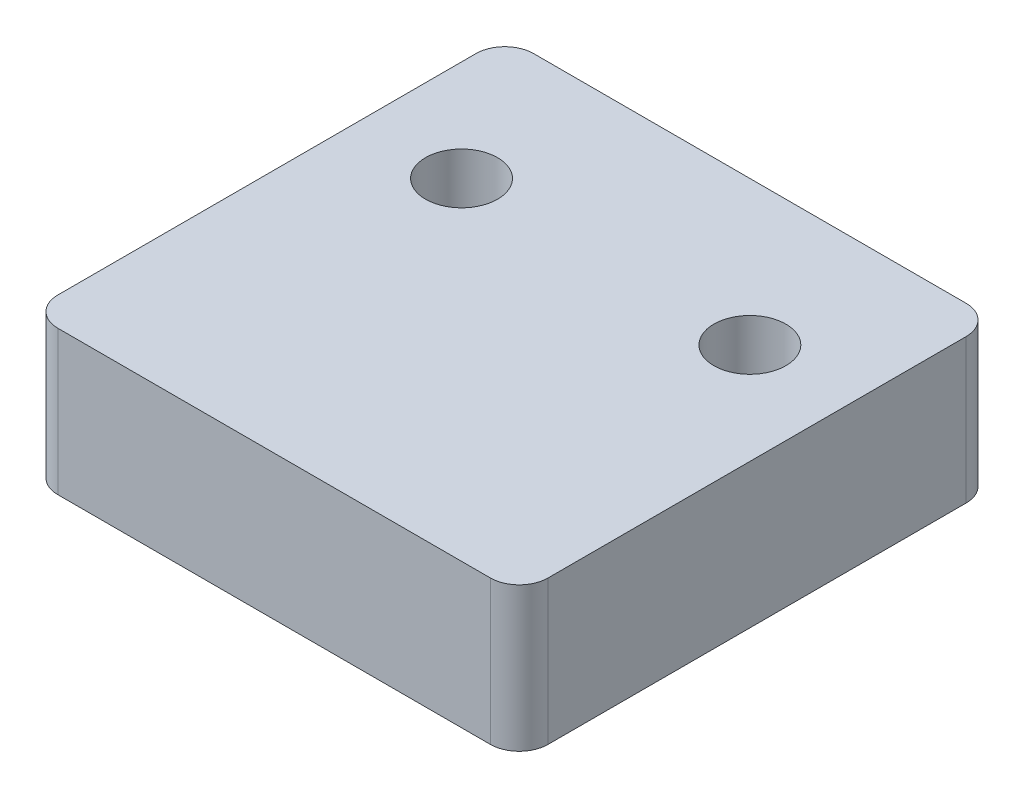
ISO-10303-21;
HEADER;
FILE_DESCRIPTION(('STEP AP214'),'2;1');
FILE_NAME('part.step','',(''),(''),'','','');
FILE_SCHEMA(('AUTOMOTIVE_DESIGN { 1 0 10303 214 1 1 1 1 }'));
ENDSEC;
DATA;
#1=APPLICATION_CONTEXT('core data for automotive mechanical design processes');
#2=APPLICATION_PROTOCOL_DEFINITION('international standard','automotive_design',2000,#1);
#3=PRODUCT_CONTEXT('',#1,'mechanical');
#4=PRODUCT('Part','Part','',(#3));
#5=PRODUCT_RELATED_PRODUCT_CATEGORY('part','',(#4));
#6=PRODUCT_DEFINITION_FORMATION('','',#4);
#7=PRODUCT_DEFINITION_CONTEXT('part definition',#1,'design');
#8=PRODUCT_DEFINITION('design','',#6,#7);
#9=PRODUCT_DEFINITION_SHAPE('','',#8);
#10=(LENGTH_UNIT() NAMED_UNIT(*) SI_UNIT(.MILLI.,.METRE.));
#11=(NAMED_UNIT(*) PLANE_ANGLE_UNIT() SI_UNIT($,.RADIAN.));
#12=(NAMED_UNIT(*) SI_UNIT($,.STERADIAN.) SOLID_ANGLE_UNIT());
#13=UNCERTAINTY_MEASURE_WITH_UNIT(LENGTH_MEASURE(1.E-05),#10,'distance_accuracy_value','');
#14=(GEOMETRIC_REPRESENTATION_CONTEXT(3) GLOBAL_UNCERTAINTY_ASSIGNED_CONTEXT((#13)) GLOBAL_UNIT_ASSIGNED_CONTEXT((#10,
#11,#12)) REPRESENTATION_CONTEXT('',''));
#15=CARTESIAN_POINT('',(0.,0.,0.));
#16=DIRECTION('',(0.,0.,1.));
#17=DIRECTION('',(1.,0.,0.));
#18=AXIS2_PLACEMENT_3D('',#15,#16,#17);
#19=CARTESIAN_POINT('',(2.,10.,-2.));
#20=DIRECTION('',(0.,1.,0.));
#21=DIRECTION('',(0.,0.,1.));
#22=AXIS2_PLACEMENT_3D('',#19,#20,#21);
#23=CYLINDRICAL_SURFACE('',#22,2.);
#24=DIRECTION('',(0.,1.,0.));
#25=VECTOR('',#24,1.);
#26=CARTESIAN_POINT('',(0.,10.,-2.));
#27=LINE('',#26,#25);
#28=CARTESIAN_POINT('',(0.,0.,-2.));
#29=VERTEX_POINT('',#28);
#30=CARTESIAN_POINT('',(0.,10.,-2.));
#31=VERTEX_POINT('',#30);
#32=EDGE_CURVE('E147',#29,#31,#27,.T.);
#33=ORIENTED_EDGE('',*,*,#32,.F.);
#34=CARTESIAN_POINT('',(2.,0.,-2.));
#35=DIRECTION('',(0.,-1.,0.));
#36=DIRECTION('',(0.,0.,-1.));
#37=AXIS2_PLACEMENT_3D('',#34,#35,#36);
#38=CIRCLE('',#37,2.);
#39=CARTESIAN_POINT('',(2.,0.,0.));
#40=VERTEX_POINT('',#39);
#41=EDGE_CURVE('E39',#40,#29,#38,.T.);
#42=ORIENTED_EDGE('',*,*,#41,.F.);
#43=DIRECTION('',(0.,1.,0.));
#44=VECTOR('',#43,1.);
#45=CARTESIAN_POINT('',(2.,10.,0.));
#46=LINE('',#45,#44);
#47=CARTESIAN_POINT('',(2.,10.,0.));
#48=VERTEX_POINT('',#47);
#49=EDGE_CURVE('E99',#48,#40,#46,.F.);
#50=ORIENTED_EDGE('',*,*,#49,.F.);
#51=CARTESIAN_POINT('',(2.,10.,-2.));
#52=DIRECTION('',(0.,-1.,0.));
#53=DIRECTION('',(0.,0.,-1.));
#54=AXIS2_PLACEMENT_3D('',#51,#52,#53);
#55=CIRCLE('',#54,2.);
#56=EDGE_CURVE('E11',#31,#48,#55,.F.);
#57=ORIENTED_EDGE('',*,*,#56,.F.);
#58=EDGE_LOOP('',(#33,#42,#50,#57));
#59=FACE_BOUND('',#58,.T.);
#60=ADVANCED_FACE('F32',(#59),#23,.T.);
#61=CARTESIAN_POINT('',(2.,10.,-31.));
#62=DIRECTION('',(0.,1.,0.));
#63=DIRECTION('',(0.,0.,1.));
#64=AXIS2_PLACEMENT_3D('',#61,#62,#63);
#65=CYLINDRICAL_SURFACE('',#64,2.);
#66=DIRECTION('',(0.,1.,0.));
#67=VECTOR('',#66,1.);
#68=CARTESIAN_POINT('',(2.,10.,-33.));
#69=LINE('',#68,#67);
#70=CARTESIAN_POINT('',(2.,0.,-33.));
#71=VERTEX_POINT('',#70);
#72=CARTESIAN_POINT('',(2.,10.,-33.));
#73=VERTEX_POINT('',#72);
#74=EDGE_CURVE('E137',#71,#73,#69,.T.);
#75=ORIENTED_EDGE('',*,*,#74,.F.);
#76=CARTESIAN_POINT('',(2.,0.,-31.));
#77=DIRECTION('',(0.,-1.,0.));
#78=DIRECTION('',(0.,0.,-1.));
#79=AXIS2_PLACEMENT_3D('',#76,#77,#78);
#80=CIRCLE('',#79,2.);
#81=CARTESIAN_POINT('',(0.,0.,-31.));
#82=VERTEX_POINT('',#81);
#83=EDGE_CURVE('E143',#82,#71,#80,.T.);
#84=ORIENTED_EDGE('',*,*,#83,.F.);
#85=DIRECTION('',(0.,1.,0.));
#86=VECTOR('',#85,1.);
#87=CARTESIAN_POINT('',(0.,10.,-31.));
#88=LINE('',#87,#86);
#89=CARTESIAN_POINT('',(0.,10.,-31.));
#90=VERTEX_POINT('',#89);
#91=EDGE_CURVE('E140',#90,#82,#88,.F.);
#92=ORIENTED_EDGE('',*,*,#91,.F.);
#93=CARTESIAN_POINT('',(2.,10.,-31.));
#94=DIRECTION('',(0.,-1.,0.));
#95=DIRECTION('',(0.,0.,-1.));
#96=AXIS2_PLACEMENT_3D('',#93,#94,#95);
#97=CIRCLE('',#96,2.);
#98=EDGE_CURVE('E145',#73,#90,#97,.F.);
#99=ORIENTED_EDGE('',*,*,#98,.F.);
#100=EDGE_LOOP('',(#75,#84,#92,#99));
#101=FACE_BOUND('',#100,.T.);
#102=ADVANCED_FACE('F183',(#101),#65,.T.);
#103=CARTESIAN_POINT('',(32.,10.,-31.));
#104=DIRECTION('',(0.,1.,0.));
#105=DIRECTION('',(0.,0.,1.));
#106=AXIS2_PLACEMENT_3D('',#103,#104,#105);
#107=CYLINDRICAL_SURFACE('',#106,2.);
#108=DIRECTION('',(0.,1.,0.));
#109=VECTOR('',#108,1.);
#110=CARTESIAN_POINT('',(34.,10.,-31.));
#111=LINE('',#110,#109);
#112=CARTESIAN_POINT('',(34.,0.,-31.));
#113=VERTEX_POINT('',#112);
#114=CARTESIAN_POINT('',(34.,10.,-31.));
#115=VERTEX_POINT('',#114);
#116=EDGE_CURVE('E127',#113,#115,#111,.T.);
#117=ORIENTED_EDGE('',*,*,#116,.F.);
#118=CARTESIAN_POINT('',(32.,0.,-31.));
#119=DIRECTION('',(0.,-1.,0.));
#120=DIRECTION('',(0.,0.,-1.));
#121=AXIS2_PLACEMENT_3D('',#118,#119,#120);
#122=CIRCLE('',#121,2.);
#123=CARTESIAN_POINT('',(32.,0.,-33.));
#124=VERTEX_POINT('',#123);
#125=EDGE_CURVE('E133',#124,#113,#122,.T.);
#126=ORIENTED_EDGE('',*,*,#125,.F.);
#127=DIRECTION('',(0.,1.,0.));
#128=VECTOR('',#127,1.);
#129=CARTESIAN_POINT('',(32.,10.,-33.));
#130=LINE('',#129,#128);
#131=CARTESIAN_POINT('',(32.,10.,-33.));
#132=VERTEX_POINT('',#131);
#133=EDGE_CURVE('E130',#132,#124,#130,.F.);
#134=ORIENTED_EDGE('',*,*,#133,.F.);
#135=CARTESIAN_POINT('',(32.,10.,-31.));
#136=DIRECTION('',(0.,-1.,0.));
#137=DIRECTION('',(0.,0.,-1.));
#138=AXIS2_PLACEMENT_3D('',#135,#136,#137);
#139=CIRCLE('',#138,2.);
#140=EDGE_CURVE('E135',#115,#132,#139,.F.);
#141=ORIENTED_EDGE('',*,*,#140,.F.);
#142=EDGE_LOOP('',(#117,#126,#134,#141));
#143=FACE_BOUND('',#142,.T.);
#144=ADVANCED_FACE('F178',(#143),#107,.T.);
#145=CARTESIAN_POINT('',(32.,10.,-2.));
#146=DIRECTION('',(0.,1.,0.));
#147=DIRECTION('',(0.,0.,1.));
#148=AXIS2_PLACEMENT_3D('',#145,#146,#147);
#149=CYLINDRICAL_SURFACE('',#148,2.);
#150=DIRECTION('',(0.,1.,0.));
#151=VECTOR('',#150,1.);
#152=CARTESIAN_POINT('',(32.,10.,0.));
#153=LINE('',#152,#151);
#154=CARTESIAN_POINT('',(32.,0.,0.));
#155=VERTEX_POINT('',#154);
#156=CARTESIAN_POINT('',(32.,10.,0.));
#157=VERTEX_POINT('',#156);
#158=EDGE_CURVE('E98',#155,#157,#153,.T.);
#159=ORIENTED_EDGE('',*,*,#158,.F.);
#160=CARTESIAN_POINT('',(32.,0.,-2.));
#161=DIRECTION('',(0.,-1.,0.));
#162=DIRECTION('',(0.,0.,-1.));
#163=AXIS2_PLACEMENT_3D('',#160,#161,#162);
#164=CIRCLE('',#163,2.);
#165=CARTESIAN_POINT('',(34.,0.,-2.));
#166=VERTEX_POINT('',#165);
#167=EDGE_CURVE('E105',#166,#155,#164,.T.);
#168=ORIENTED_EDGE('',*,*,#167,.F.);
#169=DIRECTION('',(0.,1.,0.));
#170=VECTOR('',#169,1.);
#171=CARTESIAN_POINT('',(34.,10.,-2.));
#172=LINE('',#171,#170);
#173=CARTESIAN_POINT('',(34.,10.,-2.));
#174=VERTEX_POINT('',#173);
#175=EDGE_CURVE('E112',#174,#166,#172,.F.);
#176=ORIENTED_EDGE('',*,*,#175,.F.);
#177=CARTESIAN_POINT('',(32.,10.,-2.));
#178=DIRECTION('',(0.,-1.,0.));
#179=DIRECTION('',(0.,0.,-1.));
#180=AXIS2_PLACEMENT_3D('',#177,#178,#179);
#181=CIRCLE('',#180,2.);
#182=EDGE_CURVE('E111',#157,#174,#181,.F.);
#183=ORIENTED_EDGE('',*,*,#182,.F.);
#184=EDGE_LOOP('',(#159,#168,#176,#183));
#185=FACE_BOUND('',#184,.T.);
#186=ADVANCED_FACE('F115',(#185),#149,.T.);
#187=CARTESIAN_POINT('',(0.,10.,0.));
#188=DIRECTION('',(1.,0.,0.));
#189=DIRECTION('',(0.,0.,-1.));
#190=AXIS2_PLACEMENT_3D('',#187,#188,#189);
#191=PLANE('',#190);
#192=DIRECTION('',(0.,0.,1.));
#193=VECTOR('',#192,1.);
#194=CARTESIAN_POINT('',(0.,0.,0.));
#195=LINE('',#194,#193);
#196=EDGE_CURVE('E102',#82,#29,#195,.T.);
#197=ORIENTED_EDGE('',*,*,#196,.T.);
#198=ORIENTED_EDGE('',*,*,#32,.T.);
#199=DIRECTION('',(0.,0.,1.));
#200=VECTOR('',#199,1.);
#201=CARTESIAN_POINT('',(0.,10.,0.));
#202=LINE('',#201,#200);
#203=EDGE_CURVE('E164',#90,#31,#202,.T.);
#204=ORIENTED_EDGE('',*,*,#203,.F.);
#205=ORIENTED_EDGE('',*,*,#91,.T.);
#206=EDGE_LOOP('',(#197,#198,#204,#205));
#207=FACE_BOUND('',#206,.T.);
#208=ADVANCED_FACE('F154',(#207),#191,.F.);
#209=CARTESIAN_POINT('',(0.,10.,0.));
#210=DIRECTION('',(0.,0.,-1.));
#211=DIRECTION('',(-1.,0.,0.));
#212=AXIS2_PLACEMENT_3D('',#209,#210,#211);
#213=PLANE('',#212);
#214=DIRECTION('',(1.,0.,0.));
#215=VECTOR('',#214,1.);
#216=CARTESIAN_POINT('',(0.,10.,0.));
#217=LINE('',#216,#215);
#218=EDGE_CURVE('E167',#48,#157,#217,.T.);
#219=ORIENTED_EDGE('',*,*,#218,.F.);
#220=ORIENTED_EDGE('',*,*,#49,.T.);
#221=DIRECTION('',(1.,0.,0.));
#222=VECTOR('',#221,1.);
#223=CARTESIAN_POINT('',(0.,0.,0.));
#224=LINE('',#223,#222);
#225=EDGE_CURVE('E93',#40,#155,#224,.T.);
#226=ORIENTED_EDGE('',*,*,#225,.T.);
#227=ORIENTED_EDGE('',*,*,#158,.T.);
#228=EDGE_LOOP('',(#219,#220,#226,#227));
#229=FACE_BOUND('',#228,.T.);
#230=ADVANCED_FACE('F96',(#229),#213,.F.);
#231=CARTESIAN_POINT('',(34.,10.,0.));
#232=DIRECTION('',(-1.,0.,0.));
#233=DIRECTION('',(0.,0.,1.));
#234=AXIS2_PLACEMENT_3D('',#231,#232,#233);
#235=PLANE('',#234);
#236=DIRECTION('',(0.,0.,-1.));
#237=VECTOR('',#236,1.);
#238=CARTESIAN_POINT('',(34.,0.,0.));
#239=LINE('',#238,#237);
#240=EDGE_CURVE('E101',#166,#113,#239,.T.);
#241=ORIENTED_EDGE('',*,*,#240,.T.);
#242=ORIENTED_EDGE('',*,*,#116,.T.);
#243=DIRECTION('',(0.,0.,-1.));
#244=VECTOR('',#243,1.);
#245=CARTESIAN_POINT('',(34.,10.,0.));
#246=LINE('',#245,#244);
#247=EDGE_CURVE('E120',#174,#115,#246,.T.);
#248=ORIENTED_EDGE('',*,*,#247,.F.);
#249=ORIENTED_EDGE('',*,*,#175,.T.);
#250=EDGE_LOOP('',(#241,#242,#248,#249));
#251=FACE_BOUND('',#250,.T.);
#252=ADVANCED_FACE('F175',(#251),#235,.F.);
#253=CARTESIAN_POINT('',(0.,10.,-33.));
#254=DIRECTION('',(0.,0.,1.));
#255=DIRECTION('',(1.,0.,0.));
#256=AXIS2_PLACEMENT_3D('',#253,#254,#255);
#257=PLANE('',#256);
#258=DIRECTION('',(-1.,0.,0.));
#259=VECTOR('',#258,1.);
#260=CARTESIAN_POINT('',(0.,0.,-33.));
#261=LINE('',#260,#259);
#262=EDGE_CURVE('E123',#124,#71,#261,.T.);
#263=ORIENTED_EDGE('',*,*,#262,.T.);
#264=ORIENTED_EDGE('',*,*,#74,.T.);
#265=DIRECTION('',(-1.,0.,0.));
#266=VECTOR('',#265,1.);
#267=CARTESIAN_POINT('',(0.,10.,-33.));
#268=LINE('',#267,#266);
#269=EDGE_CURVE('E116',#132,#73,#268,.T.);
#270=ORIENTED_EDGE('',*,*,#269,.F.);
#271=ORIENTED_EDGE('',*,*,#133,.T.);
#272=EDGE_LOOP('',(#263,#264,#270,#271));
#273=FACE_BOUND('',#272,.T.);
#274=ADVANCED_FACE('F180',(#273),#257,.F.);
#275=CARTESIAN_POINT('',(0.,10.,0.));
#276=DIRECTION('',(0.,-1.,0.));
#277=DIRECTION('',(0.,0.,-1.));
#278=AXIS2_PLACEMENT_3D('',#275,#276,#277);
#279=PLANE('',#278);
#280=CARTESIAN_POINT('',(27.,10.,-23.));
#281=DIRECTION('',(0.,1.,0.));
#282=DIRECTION('',(0.,0.,1.));
#283=AXIS2_PLACEMENT_3D('',#280,#281,#282);
#284=CIRCLE('',#283,2.5);
#285=CARTESIAN_POINT('',(27.,10.,-20.5));
#286=VERTEX_POINT('',#285);
#287=EDGE_CURVE('E222',#286,#286,#284,.T.);
#288=ORIENTED_EDGE('',*,*,#287,.F.);
#289=EDGE_LOOP('',(#288));
#290=FACE_BOUND('',#289,.T.);
#291=CARTESIAN_POINT('',(7.,10.,-23.));
#292=DIRECTION('',(0.,1.,0.));
#293=DIRECTION('',(0.,0.,1.));
#294=AXIS2_PLACEMENT_3D('',#291,#292,#293);
#295=CIRCLE('',#294,2.5);
#296=CARTESIAN_POINT('',(7.,10.,-20.5));
#297=VERTEX_POINT('',#296);
#298=EDGE_CURVE('E159',#297,#297,#295,.T.);
#299=ORIENTED_EDGE('',*,*,#298,.F.);
#300=EDGE_LOOP('',(#299));
#301=FACE_BOUND('',#300,.T.);
#302=ORIENTED_EDGE('',*,*,#203,.T.);
#303=ORIENTED_EDGE('',*,*,#56,.T.);
#304=ORIENTED_EDGE('',*,*,#218,.T.);
#305=ORIENTED_EDGE('',*,*,#182,.T.);
#306=ORIENTED_EDGE('',*,*,#247,.T.);
#307=ORIENTED_EDGE('',*,*,#140,.T.);
#308=ORIENTED_EDGE('',*,*,#269,.T.);
#309=ORIENTED_EDGE('',*,*,#98,.T.);
#310=EDGE_LOOP('',(#302,#303,#304,#305,#306,#307,#308,#309));
#311=FACE_BOUND('',#310,.T.);
#312=ADVANCED_FACE('F173',(#290,#301,#311),#279,.F.);
#313=CARTESIAN_POINT('',(0.,0.,0.));
#314=DIRECTION('',(0.,-1.,0.));
#315=DIRECTION('',(0.,0.,-1.));
#316=AXIS2_PLACEMENT_3D('',#313,#314,#315);
#317=PLANE('',#316);
#318=CARTESIAN_POINT('',(27.,0.,-23.));
#319=DIRECTION('',(0.,1.,0.));
#320=DIRECTION('',(0.,0.,1.));
#321=AXIS2_PLACEMENT_3D('',#318,#319,#320);
#322=CIRCLE('',#321,2.5);
#323=CARTESIAN_POINT('',(27.,0.,-20.5));
#324=VERTEX_POINT('',#323);
#325=EDGE_CURVE('E219',#324,#324,#322,.T.);
#326=ORIENTED_EDGE('',*,*,#325,.T.);
#327=EDGE_LOOP('',(#326));
#328=FACE_BOUND('',#327,.T.);
#329=CARTESIAN_POINT('',(7.,0.,-23.));
#330=DIRECTION('',(0.,1.,0.));
#331=DIRECTION('',(0.,0.,1.));
#332=AXIS2_PLACEMENT_3D('',#329,#330,#331);
#333=CIRCLE('',#332,2.5);
#334=CARTESIAN_POINT('',(7.,0.,-20.5));
#335=VERTEX_POINT('',#334);
#336=EDGE_CURVE('E156',#335,#335,#333,.T.);
#337=ORIENTED_EDGE('',*,*,#336,.T.);
#338=EDGE_LOOP('',(#337));
#339=FACE_BOUND('',#338,.T.);
#340=ORIENTED_EDGE('',*,*,#225,.F.);
#341=ORIENTED_EDGE('',*,*,#41,.T.);
#342=ORIENTED_EDGE('',*,*,#196,.F.);
#343=ORIENTED_EDGE('',*,*,#83,.T.);
#344=ORIENTED_EDGE('',*,*,#262,.F.);
#345=ORIENTED_EDGE('',*,*,#125,.T.);
#346=ORIENTED_EDGE('',*,*,#240,.F.);
#347=ORIENTED_EDGE('',*,*,#167,.T.);
#348=EDGE_LOOP('',(#340,#341,#342,#343,#344,#345,#346,#347));
#349=FACE_BOUND('',#348,.T.);
#350=ADVANCED_FACE('F106',(#328,#339,#349),#317,.T.);
#351=CARTESIAN_POINT('',(7.,0.,-23.));
#352=DIRECTION('',(0.,1.,0.));
#353=DIRECTION('',(0.,0.,1.));
#354=AXIS2_PLACEMENT_3D('',#351,#352,#353);
#355=CYLINDRICAL_SURFACE('',#354,2.5);
#356=ORIENTED_EDGE('',*,*,#336,.F.);
#357=EDGE_LOOP('',(#356));
#358=FACE_BOUND('',#357,.T.);
#359=ORIENTED_EDGE('',*,*,#298,.T.);
#360=EDGE_LOOP('',(#359));
#361=FACE_BOUND('',#360,.T.);
#362=ADVANCED_FACE('F203',(#358,#361),#355,.F.);
#363=CARTESIAN_POINT('',(27.,0.,-23.));
#364=DIRECTION('',(0.,1.,0.));
#365=DIRECTION('',(0.,0.,1.));
#366=AXIS2_PLACEMENT_3D('',#363,#364,#365);
#367=CYLINDRICAL_SURFACE('',#366,2.5);
#368=ORIENTED_EDGE('',*,*,#325,.F.);
#369=EDGE_LOOP('',(#368));
#370=FACE_BOUND('',#369,.T.);
#371=ORIENTED_EDGE('',*,*,#287,.T.);
#372=EDGE_LOOP('',(#371));
#373=FACE_BOUND('',#372,.T.);
#374=ADVANCED_FACE('F210',(#370,#373),#367,.F.);
#375=CLOSED_SHELL('',(#60,#102,#144,#186,#208,#230,#252,#274,#312,#350,#362,#374));
#376=MANIFOLD_SOLID_BREP('B2',#375);
#377=ADVANCED_BREP_SHAPE_REPRESENTATION('',(#18,#376),#14);
#378=SHAPE_DEFINITION_REPRESENTATION(#9,#377);
ENDSEC;
END-ISO-10303-21;
